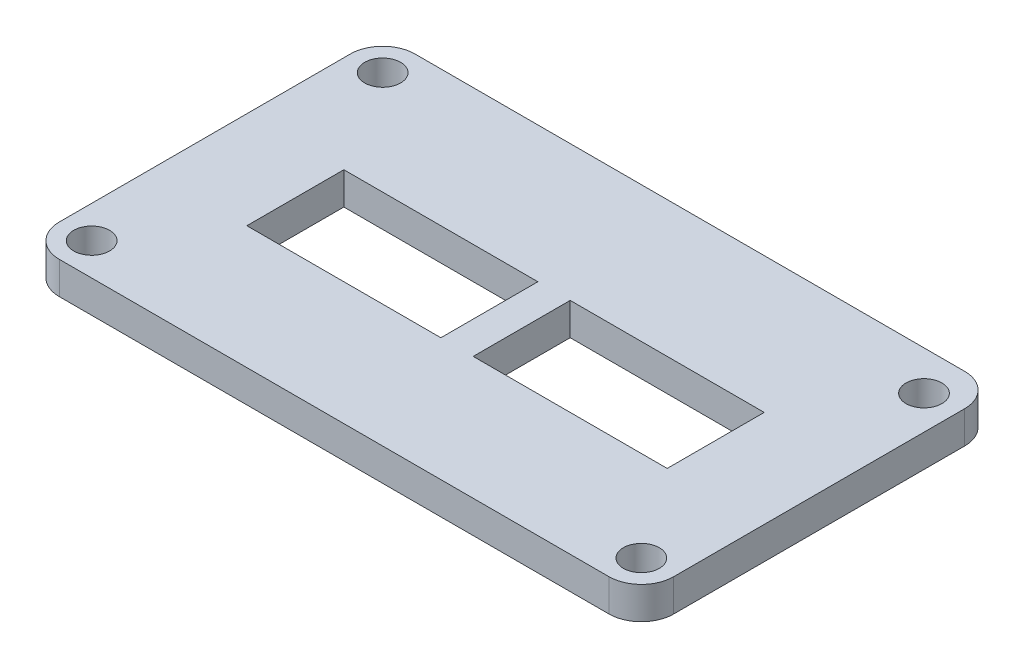
ISO-10303-21;
HEADER;
FILE_DESCRIPTION(('STEP AP214'),'2;1');
FILE_NAME('part.step','',(''),(''),'','','');
FILE_SCHEMA(('AUTOMOTIVE_DESIGN { 1 0 10303 214 1 1 1 1 }'));
ENDSEC;
DATA;
#1=APPLICATION_CONTEXT('core data for automotive mechanical design processes');
#2=APPLICATION_PROTOCOL_DEFINITION('international standard','automotive_design',2000,#1);
#3=PRODUCT_CONTEXT('',#1,'mechanical');
#4=PRODUCT('Part','Part','',(#3));
#5=PRODUCT_RELATED_PRODUCT_CATEGORY('part','',(#4));
#6=PRODUCT_DEFINITION_FORMATION('','',#4);
#7=PRODUCT_DEFINITION_CONTEXT('part definition',#1,'design');
#8=PRODUCT_DEFINITION('design','',#6,#7);
#9=PRODUCT_DEFINITION_SHAPE('','',#8);
#10=(LENGTH_UNIT() NAMED_UNIT(*) SI_UNIT(.MILLI.,.METRE.));
#11=(NAMED_UNIT(*) PLANE_ANGLE_UNIT() SI_UNIT($,.RADIAN.));
#12=(NAMED_UNIT(*) SI_UNIT($,.STERADIAN.) SOLID_ANGLE_UNIT());
#13=UNCERTAINTY_MEASURE_WITH_UNIT(LENGTH_MEASURE(1.E-05),#10,'distance_accuracy_value','');
#14=(GEOMETRIC_REPRESENTATION_CONTEXT(3) GLOBAL_UNCERTAINTY_ASSIGNED_CONTEXT((#13)) GLOBAL_UNIT_ASSIGNED_CONTEXT((#10,
#11,#12)) REPRESENTATION_CONTEXT('',''));
#15=CARTESIAN_POINT('',(0.,0.,0.));
#16=DIRECTION('',(0.,0.,1.));
#17=DIRECTION('',(1.,0.,0.));
#18=AXIS2_PLACEMENT_3D('',#15,#16,#17);
#19=CARTESIAN_POINT('',(-24.13,2.54,13.97));
#20=DIRECTION('',(0.,0.,-1.));
#21=DIRECTION('',(-1.,0.,0.));
#22=AXIS2_PLACEMENT_3D('',#19,#20,#21);
#23=PLANE('',#22);
#24=DIRECTION('',(1.,0.,0.));
#25=VECTOR('',#24,1.);
#26=CARTESIAN_POINT('',(-24.13,0.,13.97));
#27=LINE('',#26,#25);
#28=CARTESIAN_POINT('',(-21.59,0.,13.97));
#29=VERTEX_POINT('',#28);
#30=CARTESIAN_POINT('',(21.59,0.,13.97));
#31=VERTEX_POINT('',#30);
#32=EDGE_CURVE('E179',#29,#31,#27,.T.);
#33=ORIENTED_EDGE('',*,*,#32,.T.);
#34=DIRECTION('',(0.,-1.,0.));
#35=VECTOR('',#34,1.);
#36=CARTESIAN_POINT('',(21.59,2.54,13.97));
#37=LINE('',#36,#35);
#38=CARTESIAN_POINT('',(21.59,2.54,13.97));
#39=VERTEX_POINT('',#38);
#40=EDGE_CURVE('E268',#31,#39,#37,.F.);
#41=ORIENTED_EDGE('',*,*,#40,.T.);
#42=DIRECTION('',(1.,0.,0.));
#43=VECTOR('',#42,1.);
#44=CARTESIAN_POINT('',(-24.13,2.54,13.97));
#45=LINE('',#44,#43);
#46=CARTESIAN_POINT('',(-21.59,2.54,13.97));
#47=VERTEX_POINT('',#46);
#48=EDGE_CURVE('E203',#47,#39,#45,.T.);
#49=ORIENTED_EDGE('',*,*,#48,.F.);
#50=DIRECTION('',(0.,-1.,0.));
#51=VECTOR('',#50,1.);
#52=CARTESIAN_POINT('',(-21.59,2.54,13.97));
#53=LINE('',#52,#51);
#54=EDGE_CURVE('E265',#47,#29,#53,.T.);
#55=ORIENTED_EDGE('',*,*,#54,.T.);
#56=EDGE_LOOP('',(#33,#41,#49,#55));
#57=FACE_BOUND('',#56,.T.);
#58=ADVANCED_FACE('F33',(#57),#23,.F.);
#59=CARTESIAN_POINT('',(24.13,2.54,-13.97));
#60=DIRECTION('',(1.,0.,0.));
#61=DIRECTION('',(0.,0.,-1.));
#62=AXIS2_PLACEMENT_3D('',#59,#60,#61);
#63=PLANE('',#62);
#64=DIRECTION('',(0.,0.,1.));
#65=VECTOR('',#64,1.);
#66=CARTESIAN_POINT('',(24.13,0.,-13.97));
#67=LINE('',#66,#65);
#68=CARTESIAN_POINT('',(24.13,0.,-11.43));
#69=VERTEX_POINT('',#68);
#70=CARTESIAN_POINT('',(24.13,0.,11.43));
#71=VERTEX_POINT('',#70);
#72=EDGE_CURVE('E218',#69,#71,#67,.T.);
#73=ORIENTED_EDGE('',*,*,#72,.F.);
#74=DIRECTION('',(0.,-1.,0.));
#75=VECTOR('',#74,1.);
#76=CARTESIAN_POINT('',(24.13,2.54,-11.43));
#77=LINE('',#76,#75);
#78=CARTESIAN_POINT('',(24.13,2.54,-11.43));
#79=VERTEX_POINT('',#78);
#80=EDGE_CURVE('E256',#69,#79,#77,.F.);
#81=ORIENTED_EDGE('',*,*,#80,.T.);
#82=DIRECTION('',(0.,0.,1.));
#83=VECTOR('',#82,1.);
#84=CARTESIAN_POINT('',(24.13,2.54,-13.97));
#85=LINE('',#84,#83);
#86=CARTESIAN_POINT('',(24.13,2.54,11.43));
#87=VERTEX_POINT('',#86);
#88=EDGE_CURVE('E206',#79,#87,#85,.T.);
#89=ORIENTED_EDGE('',*,*,#88,.T.);
#90=DIRECTION('',(0.,-1.,0.));
#91=VECTOR('',#90,1.);
#92=CARTESIAN_POINT('',(24.13,0.,11.43));
#93=LINE('',#92,#91);
#94=EDGE_CURVE('E253',#87,#71,#93,.T.);
#95=ORIENTED_EDGE('',*,*,#94,.T.);
#96=EDGE_LOOP('',(#73,#81,#89,#95));
#97=FACE_BOUND('',#96,.T.);
#98=ADVANCED_FACE('F292',(#97),#63,.T.);
#99=CARTESIAN_POINT('',(-24.13,2.54,-13.97));
#100=DIRECTION('',(0.,0.,-1.));
#101=DIRECTION('',(-1.,0.,0.));
#102=AXIS2_PLACEMENT_3D('',#99,#100,#101);
#103=PLANE('',#102);
#104=DIRECTION('',(1.,0.,0.));
#105=VECTOR('',#104,1.);
#106=CARTESIAN_POINT('',(-24.13,2.54,-13.97));
#107=LINE('',#106,#105);
#108=CARTESIAN_POINT('',(-21.59,2.54,-13.97));
#109=VERTEX_POINT('',#108);
#110=CARTESIAN_POINT('',(21.59,2.54,-13.97));
#111=VERTEX_POINT('',#110);
#112=EDGE_CURVE('E210',#109,#111,#107,.T.);
#113=ORIENTED_EDGE('',*,*,#112,.T.);
#114=DIRECTION('',(0.,-1.,0.));
#115=VECTOR('',#114,1.);
#116=CARTESIAN_POINT('',(21.59,2.54,-13.97));
#117=LINE('',#116,#115);
#118=CARTESIAN_POINT('',(21.59,0.,-13.97));
#119=VERTEX_POINT('',#118);
#120=EDGE_CURVE('E242',#111,#119,#117,.T.);
#121=ORIENTED_EDGE('',*,*,#120,.T.);
#122=DIRECTION('',(1.,0.,0.));
#123=VECTOR('',#122,1.);
#124=CARTESIAN_POINT('',(-24.13,0.,-13.97));
#125=LINE('',#124,#123);
#126=CARTESIAN_POINT('',(-21.59,0.,-13.97));
#127=VERTEX_POINT('',#126);
#128=EDGE_CURVE('E221',#127,#119,#125,.T.);
#129=ORIENTED_EDGE('',*,*,#128,.F.);
#130=DIRECTION('',(0.,-1.,0.));
#131=VECTOR('',#130,1.);
#132=CARTESIAN_POINT('',(-21.59,2.54,-13.97));
#133=LINE('',#132,#131);
#134=EDGE_CURVE('E240',#127,#109,#133,.F.);
#135=ORIENTED_EDGE('',*,*,#134,.T.);
#136=EDGE_LOOP('',(#113,#121,#129,#135));
#137=FACE_BOUND('',#136,.T.);
#138=ADVANCED_FACE('F299',(#137),#103,.T.);
#139=CARTESIAN_POINT('',(-24.13,2.54,-13.97));
#140=DIRECTION('',(1.,0.,0.));
#141=DIRECTION('',(0.,0.,-1.));
#142=AXIS2_PLACEMENT_3D('',#139,#140,#141);
#143=PLANE('',#142);
#144=DIRECTION('',(0.,0.,1.));
#145=VECTOR('',#144,1.);
#146=CARTESIAN_POINT('',(-24.13,0.,-13.97));
#147=LINE('',#146,#145);
#148=CARTESIAN_POINT('',(-24.13,0.,-11.43));
#149=VERTEX_POINT('',#148);
#150=CARTESIAN_POINT('',(-24.13,0.,11.43));
#151=VERTEX_POINT('',#150);
#152=EDGE_CURVE('E207',#149,#151,#147,.T.);
#153=ORIENTED_EDGE('',*,*,#152,.T.);
#154=DIRECTION('',(0.,-1.,0.));
#155=VECTOR('',#154,1.);
#156=CARTESIAN_POINT('',(-24.13,2.54,11.43));
#157=LINE('',#156,#155);
#158=CARTESIAN_POINT('',(-24.13,2.54,11.43));
#159=VERTEX_POINT('',#158);
#160=EDGE_CURVE('E11',#151,#159,#157,.F.);
#161=ORIENTED_EDGE('',*,*,#160,.T.);
#162=DIRECTION('',(0.,0.,1.));
#163=VECTOR('',#162,1.);
#164=CARTESIAN_POINT('',(-24.13,2.54,-13.97));
#165=LINE('',#164,#163);
#166=CARTESIAN_POINT('',(-24.13,2.54,-11.43));
#167=VERTEX_POINT('',#166);
#168=EDGE_CURVE('E213',#167,#159,#165,.T.);
#169=ORIENTED_EDGE('',*,*,#168,.F.);
#170=DIRECTION('',(0.,-1.,0.));
#171=VECTOR('',#170,1.);
#172=CARTESIAN_POINT('',(-24.13,0.,-11.43));
#173=LINE('',#172,#171);
#174=EDGE_CURVE('E41',#167,#149,#173,.T.);
#175=ORIENTED_EDGE('',*,*,#174,.T.);
#176=EDGE_LOOP('',(#153,#161,#169,#175));
#177=FACE_BOUND('',#176,.T.);
#178=ADVANCED_FACE('F272',(#177),#143,.F.);
#179=CARTESIAN_POINT('',(0.,2.54,0.));
#180=DIRECTION('',(0.,-1.,0.));
#181=DIRECTION('',(0.,0.,-1.));
#182=AXIS2_PLACEMENT_3D('',#179,#180,#181);
#183=PLANE('',#182);
#184=CARTESIAN_POINT('',(21.4835766386377,2.54,-10.8783364759204));
#185=DIRECTION('',(0.,1.,0.));
#186=DIRECTION('',(0.,0.,1.));
#187=AXIS2_PLACEMENT_3D('',#184,#185,#186);
#188=CIRCLE('',#187,1.40969999999999);
#189=CARTESIAN_POINT('',(21.4835766386377,2.54,-9.46863647592038));
#190=VERTEX_POINT('',#189);
#191=EDGE_CURVE('E536',#190,#190,#188,.T.);
#192=ORIENTED_EDGE('',*,*,#191,.F.);
#193=EDGE_LOOP('',(#192));
#194=FACE_BOUND('',#193,.T.);
#195=CARTESIAN_POINT('',(21.59,2.54,11.43));
#196=DIRECTION('',(0.,1.,0.));
#197=DIRECTION('',(0.,0.,1.));
#198=AXIS2_PLACEMENT_3D('',#195,#196,#197);
#199=CIRCLE('',#198,1.40969999999999);
#200=CARTESIAN_POINT('',(21.59,2.54,12.8397));
#201=VERTEX_POINT('',#200);
#202=EDGE_CURVE('E530',#201,#201,#199,.T.);
#203=ORIENTED_EDGE('',*,*,#202,.F.);
#204=EDGE_LOOP('',(#203));
#205=FACE_BOUND('',#204,.T.);
#206=CARTESIAN_POINT('',(-21.59,2.54,11.43));
#207=DIRECTION('',(0.,1.,0.));
#208=DIRECTION('',(0.,0.,1.));
#209=AXIS2_PLACEMENT_3D('',#206,#207,#208);
#210=CIRCLE('',#209,1.40969999999999);
#211=CARTESIAN_POINT('',(-21.59,2.54,12.8397));
#212=VERTEX_POINT('',#211);
#213=EDGE_CURVE('E524',#212,#212,#210,.T.);
#214=ORIENTED_EDGE('',*,*,#213,.F.);
#215=EDGE_LOOP('',(#214));
#216=FACE_BOUND('',#215,.T.);
#217=CARTESIAN_POINT('',(-21.59,2.54,-11.43));
#218=DIRECTION('',(0.,1.,0.));
#219=DIRECTION('',(0.,0.,1.));
#220=AXIS2_PLACEMENT_3D('',#217,#218,#219);
#221=CIRCLE('',#220,1.40969999999999);
#222=CARTESIAN_POINT('',(-21.59,2.54,-10.0203));
#223=VERTEX_POINT('',#222);
#224=EDGE_CURVE('E518',#223,#223,#221,.T.);
#225=ORIENTED_EDGE('',*,*,#224,.F.);
#226=EDGE_LOOP('',(#225));
#227=FACE_BOUND('',#226,.T.);
#228=DIRECTION('',(1.,0.,0.));
#229=VECTOR('',#228,1.);
#230=CARTESIAN_POINT('',(-16.51,2.54,4.318));
#231=LINE('',#230,#229);
#232=CARTESIAN_POINT('',(-16.51,2.54,4.318));
#233=VERTEX_POINT('',#232);
#234=CARTESIAN_POINT('',(-1.27,2.54,4.318));
#235=VERTEX_POINT('',#234);
#236=EDGE_CURVE('E162',#233,#235,#231,.T.);
#237=ORIENTED_EDGE('',*,*,#236,.F.);
#238=DIRECTION('',(0.,0.,1.));
#239=VECTOR('',#238,1.);
#240=CARTESIAN_POINT('',(-16.51,2.54,-3.302));
#241=LINE('',#240,#239);
#242=CARTESIAN_POINT('',(-16.51,2.54,-3.302));
#243=VERTEX_POINT('',#242);
#244=EDGE_CURVE('E167',#243,#233,#241,.T.);
#245=ORIENTED_EDGE('',*,*,#244,.F.);
#246=DIRECTION('',(-1.,0.,0.));
#247=VECTOR('',#246,1.);
#248=CARTESIAN_POINT('',(-16.51,2.54,-3.302));
#249=LINE('',#248,#247);
#250=CARTESIAN_POINT('',(-1.27,2.54,-3.30199999999999));
#251=VERTEX_POINT('',#250);
#252=EDGE_CURVE('E172',#251,#243,#249,.T.);
#253=ORIENTED_EDGE('',*,*,#252,.F.);
#254=DIRECTION('',(0.,0.,-1.));
#255=VECTOR('',#254,1.);
#256=CARTESIAN_POINT('',(-1.27,2.54,-3.30199999999999));
#257=LINE('',#256,#255);
#258=EDGE_CURVE('E151',#235,#251,#257,.T.);
#259=ORIENTED_EDGE('',*,*,#258,.F.);
#260=EDGE_LOOP('',(#237,#245,#253,#259));
#261=FACE_BOUND('',#260,.T.);
#262=DIRECTION('',(1.,0.,0.));
#263=VECTOR('',#262,1.);
#264=CARTESIAN_POINT('',(1.27,2.54,4.318));
#265=LINE('',#264,#263);
#266=CARTESIAN_POINT('',(1.27,2.54,4.318));
#267=VERTEX_POINT('',#266);
#268=CARTESIAN_POINT('',(16.51,2.54,4.318));
#269=VERTEX_POINT('',#268);
#270=EDGE_CURVE('E184',#267,#269,#265,.T.);
#271=ORIENTED_EDGE('',*,*,#270,.F.);
#272=DIRECTION('',(0.,0.,1.));
#273=VECTOR('',#272,1.);
#274=CARTESIAN_POINT('',(1.27,2.54,-3.302));
#275=LINE('',#274,#273);
#276=CARTESIAN_POINT('',(1.27,2.54,-3.302));
#277=VERTEX_POINT('',#276);
#278=EDGE_CURVE('E182',#277,#267,#275,.T.);
#279=ORIENTED_EDGE('',*,*,#278,.F.);
#280=DIRECTION('',(-1.,0.,0.));
#281=VECTOR('',#280,1.);
#282=CARTESIAN_POINT('',(1.27,2.54,-3.302));
#283=LINE('',#282,#281);
#284=CARTESIAN_POINT('',(16.51,2.54,-3.302));
#285=VERTEX_POINT('',#284);
#286=EDGE_CURVE('E191',#285,#277,#283,.T.);
#287=ORIENTED_EDGE('',*,*,#286,.F.);
#288=DIRECTION('',(0.,0.,-1.));
#289=VECTOR('',#288,1.);
#290=CARTESIAN_POINT('',(16.51,2.54,-3.302));
#291=LINE('',#290,#289);
#292=EDGE_CURVE('E188',#269,#285,#291,.T.);
#293=ORIENTED_EDGE('',*,*,#292,.F.);
#294=EDGE_LOOP('',(#271,#279,#287,#293));
#295=FACE_BOUND('',#294,.T.);
#296=ORIENTED_EDGE('',*,*,#88,.F.);
#297=CARTESIAN_POINT('',(21.59,2.54,-11.43));
#298=DIRECTION('',(0.,-1.,0.));
#299=DIRECTION('',(0.,0.,-1.));
#300=AXIS2_PLACEMENT_3D('',#297,#298,#299);
#301=CIRCLE('',#300,2.54);
#302=EDGE_CURVE('E263',#79,#111,#301,.F.);
#303=ORIENTED_EDGE('',*,*,#302,.T.);
#304=ORIENTED_EDGE('',*,*,#112,.F.);
#305=CARTESIAN_POINT('',(-21.59,2.54,-11.43));
#306=DIRECTION('',(0.,-1.,0.));
#307=DIRECTION('',(0.,0.,-1.));
#308=AXIS2_PLACEMENT_3D('',#305,#306,#307);
#309=CIRCLE('',#308,2.54);
#310=EDGE_CURVE('E53',#109,#167,#309,.F.);
#311=ORIENTED_EDGE('',*,*,#310,.T.);
#312=ORIENTED_EDGE('',*,*,#168,.T.);
#313=CARTESIAN_POINT('',(-21.59,2.54,11.43));
#314=DIRECTION('',(0.,-1.,0.));
#315=DIRECTION('',(0.,0.,-1.));
#316=AXIS2_PLACEMENT_3D('',#313,#314,#315);
#317=CIRCLE('',#316,2.54);
#318=EDGE_CURVE('E259',#159,#47,#317,.F.);
#319=ORIENTED_EDGE('',*,*,#318,.T.);
#320=ORIENTED_EDGE('',*,*,#48,.T.);
#321=CARTESIAN_POINT('',(21.59,2.54,11.43));
#322=DIRECTION('',(0.,-1.,0.));
#323=DIRECTION('',(0.,0.,-1.));
#324=AXIS2_PLACEMENT_3D('',#321,#322,#323);
#325=CIRCLE('',#324,2.54);
#326=EDGE_CURVE('E261',#39,#87,#325,.F.);
#327=ORIENTED_EDGE('',*,*,#326,.T.);
#328=EDGE_LOOP('',(#296,#303,#304,#311,#312,#319,#320,#327));
#329=FACE_BOUND('',#328,.T.);
#330=ADVANCED_FACE('F169',(#194,#205,#216,#227,#261,#295,#329),#183,.F.);
#331=CARTESIAN_POINT('',(0.,0.,0.));
#332=DIRECTION('',(0.,-1.,0.));
#333=DIRECTION('',(0.,0.,-1.));
#334=AXIS2_PLACEMENT_3D('',#331,#332,#333);
#335=PLANE('',#334);
#336=CARTESIAN_POINT('',(21.4835766386377,0.,-10.8783364759204));
#337=DIRECTION('',(0.,1.,0.));
#338=DIRECTION('',(0.,0.,1.));
#339=AXIS2_PLACEMENT_3D('',#336,#337,#338);
#340=CIRCLE('',#339,1.4097);
#341=CARTESIAN_POINT('',(21.4835766386377,0.,-9.46863647592036));
#342=VERTEX_POINT('',#341);
#343=EDGE_CURVE('E533',#342,#342,#340,.T.);
#344=ORIENTED_EDGE('',*,*,#343,.T.);
#345=EDGE_LOOP('',(#344));
#346=FACE_BOUND('',#345,.T.);
#347=CARTESIAN_POINT('',(21.59,0.,11.43));
#348=DIRECTION('',(0.,1.,0.));
#349=DIRECTION('',(0.,0.,1.));
#350=AXIS2_PLACEMENT_3D('',#347,#348,#349);
#351=CIRCLE('',#350,1.4097);
#352=CARTESIAN_POINT('',(21.59,0.,12.8397));
#353=VERTEX_POINT('',#352);
#354=EDGE_CURVE('E527',#353,#353,#351,.T.);
#355=ORIENTED_EDGE('',*,*,#354,.T.);
#356=EDGE_LOOP('',(#355));
#357=FACE_BOUND('',#356,.T.);
#358=CARTESIAN_POINT('',(-21.59,0.,11.43));
#359=DIRECTION('',(0.,1.,0.));
#360=DIRECTION('',(0.,0.,1.));
#361=AXIS2_PLACEMENT_3D('',#358,#359,#360);
#362=CIRCLE('',#361,1.4097);
#363=CARTESIAN_POINT('',(-21.59,0.,12.8397));
#364=VERTEX_POINT('',#363);
#365=EDGE_CURVE('E521',#364,#364,#362,.T.);
#366=ORIENTED_EDGE('',*,*,#365,.T.);
#367=EDGE_LOOP('',(#366));
#368=FACE_BOUND('',#367,.T.);
#369=CARTESIAN_POINT('',(-21.59,0.,-11.43));
#370=DIRECTION('',(0.,1.,0.));
#371=DIRECTION('',(0.,0.,1.));
#372=AXIS2_PLACEMENT_3D('',#369,#370,#371);
#373=CIRCLE('',#372,1.4097);
#374=CARTESIAN_POINT('',(-21.59,0.,-10.0203));
#375=VERTEX_POINT('',#374);
#376=EDGE_CURVE('E185',#375,#375,#373,.T.);
#377=ORIENTED_EDGE('',*,*,#376,.T.);
#378=EDGE_LOOP('',(#377));
#379=FACE_BOUND('',#378,.T.);
#380=DIRECTION('',(0.,0.,-1.));
#381=VECTOR('',#380,1.);
#382=CARTESIAN_POINT('',(-16.51,0.,0.));
#383=LINE('',#382,#381);
#384=CARTESIAN_POINT('',(-16.51,0.,4.318));
#385=VERTEX_POINT('',#384);
#386=CARTESIAN_POINT('',(-16.51,0.,-3.302));
#387=VERTEX_POINT('',#386);
#388=EDGE_CURVE('E238',#385,#387,#383,.T.);
#389=ORIENTED_EDGE('',*,*,#388,.F.);
#390=DIRECTION('',(-1.,0.,0.));
#391=VECTOR('',#390,1.);
#392=CARTESIAN_POINT('',(0.,0.,4.318));
#393=LINE('',#392,#391);
#394=CARTESIAN_POINT('',(-1.27,0.,4.318));
#395=VERTEX_POINT('',#394);
#396=EDGE_CURVE('E233',#395,#385,#393,.T.);
#397=ORIENTED_EDGE('',*,*,#396,.F.);
#398=DIRECTION('',(0.,0.,1.));
#399=VECTOR('',#398,1.);
#400=CARTESIAN_POINT('',(-1.27,0.,0.));
#401=LINE('',#400,#399);
#402=CARTESIAN_POINT('',(-1.27,0.,-3.30199999999999));
#403=VERTEX_POINT('',#402);
#404=EDGE_CURVE('E154',#403,#395,#401,.T.);
#405=ORIENTED_EDGE('',*,*,#404,.F.);
#406=DIRECTION('',(1.,0.,0.));
#407=VECTOR('',#406,1.);
#408=CARTESIAN_POINT('',(0.,0.,-3.30199999999999));
#409=LINE('',#408,#407);
#410=EDGE_CURVE('E236',#387,#403,#409,.T.);
#411=ORIENTED_EDGE('',*,*,#410,.F.);
#412=EDGE_LOOP('',(#389,#397,#405,#411));
#413=FACE_BOUND('',#412,.T.);
#414=DIRECTION('',(0.,0.,-1.));
#415=VECTOR('',#414,1.);
#416=CARTESIAN_POINT('',(1.27,0.,0.));
#417=LINE('',#416,#415);
#418=CARTESIAN_POINT('',(1.27,0.,4.318));
#419=VERTEX_POINT('',#418);
#420=CARTESIAN_POINT('',(1.27,0.,-3.302));
#421=VERTEX_POINT('',#420);
#422=EDGE_CURVE('E231',#419,#421,#417,.T.);
#423=ORIENTED_EDGE('',*,*,#422,.F.);
#424=DIRECTION('',(-1.,0.,0.));
#425=VECTOR('',#424,1.);
#426=CARTESIAN_POINT('',(0.,0.,4.318));
#427=LINE('',#426,#425);
#428=CARTESIAN_POINT('',(16.51,0.,4.318));
#429=VERTEX_POINT('',#428);
#430=EDGE_CURVE('E215',#429,#419,#427,.T.);
#431=ORIENTED_EDGE('',*,*,#430,.F.);
#432=DIRECTION('',(0.,0.,1.));
#433=VECTOR('',#432,1.);
#434=CARTESIAN_POINT('',(16.51,0.,0.));
#435=LINE('',#434,#433);
#436=CARTESIAN_POINT('',(16.51,0.,-3.302));
#437=VERTEX_POINT('',#436);
#438=EDGE_CURVE('E226',#437,#429,#435,.T.);
#439=ORIENTED_EDGE('',*,*,#438,.F.);
#440=DIRECTION('',(1.,0.,0.));
#441=VECTOR('',#440,1.);
#442=CARTESIAN_POINT('',(0.,0.,-3.302));
#443=LINE('',#442,#441);
#444=EDGE_CURVE('E229',#421,#437,#443,.T.);
#445=ORIENTED_EDGE('',*,*,#444,.F.);
#446=EDGE_LOOP('',(#423,#431,#439,#445));
#447=FACE_BOUND('',#446,.T.);
#448=ORIENTED_EDGE('',*,*,#128,.T.);
#449=CARTESIAN_POINT('',(21.59,0.,-11.43));
#450=DIRECTION('',(0.,-1.,0.));
#451=DIRECTION('',(0.,0.,-1.));
#452=AXIS2_PLACEMENT_3D('',#449,#450,#451);
#453=CIRCLE('',#452,2.54);
#454=EDGE_CURVE('E251',#119,#69,#453,.T.);
#455=ORIENTED_EDGE('',*,*,#454,.T.);
#456=ORIENTED_EDGE('',*,*,#72,.T.);
#457=CARTESIAN_POINT('',(21.59,0.,11.43));
#458=DIRECTION('',(0.,-1.,0.));
#459=DIRECTION('',(0.,0.,-1.));
#460=AXIS2_PLACEMENT_3D('',#457,#458,#459);
#461=CIRCLE('',#460,2.54);
#462=EDGE_CURVE('E249',#71,#31,#461,.T.);
#463=ORIENTED_EDGE('',*,*,#462,.T.);
#464=ORIENTED_EDGE('',*,*,#32,.F.);
#465=CARTESIAN_POINT('',(-21.59,0.,11.43));
#466=DIRECTION('',(0.,-1.,0.));
#467=DIRECTION('',(0.,0.,-1.));
#468=AXIS2_PLACEMENT_3D('',#465,#466,#467);
#469=CIRCLE('',#468,2.54);
#470=EDGE_CURVE('E247',#29,#151,#469,.T.);
#471=ORIENTED_EDGE('',*,*,#470,.T.);
#472=ORIENTED_EDGE('',*,*,#152,.F.);
#473=CARTESIAN_POINT('',(-21.59,0.,-11.43));
#474=DIRECTION('',(0.,-1.,0.));
#475=DIRECTION('',(0.,0.,-1.));
#476=AXIS2_PLACEMENT_3D('',#473,#474,#475);
#477=CIRCLE('',#476,2.54);
#478=EDGE_CURVE('E245',#149,#127,#477,.T.);
#479=ORIENTED_EDGE('',*,*,#478,.T.);
#480=EDGE_LOOP('',(#448,#455,#456,#463,#464,#471,#472,#479));
#481=FACE_BOUND('',#480,.T.);
#482=ADVANCED_FACE('F275',(#346,#357,#368,#379,#413,#447,#481),#335,.T.);
#483=CARTESIAN_POINT('',(1.27,-12.954,-3.302));
#484=DIRECTION('',(-1.,0.,0.));
#485=DIRECTION('',(0.,0.,1.));
#486=AXIS2_PLACEMENT_3D('',#483,#484,#485);
#487=PLANE('',#486);
#488=ORIENTED_EDGE('',*,*,#422,.T.);
#489=DIRECTION('',(0.,1.,0.));
#490=VECTOR('',#489,1.);
#491=CARTESIAN_POINT('',(1.27,-12.954,-3.302));
#492=LINE('',#491,#490);
#493=EDGE_CURVE('E195',#421,#277,#492,.T.);
#494=ORIENTED_EDGE('',*,*,#493,.T.);
#495=ORIENTED_EDGE('',*,*,#278,.T.);
#496=DIRECTION('',(0.,1.,0.));
#497=VECTOR('',#496,1.);
#498=CARTESIAN_POINT('',(1.27,-12.954,4.318));
#499=LINE('',#498,#497);
#500=EDGE_CURVE('E194',#419,#267,#499,.T.);
#501=ORIENTED_EDGE('',*,*,#500,.F.);
#502=EDGE_LOOP('',(#488,#494,#495,#501));
#503=FACE_BOUND('',#502,.T.);
#504=ADVANCED_FACE('F355',(#503),#487,.F.);
#505=CARTESIAN_POINT('',(1.27,-12.954,-3.302));
#506=DIRECTION('',(0.,0.,-1.));
#507=DIRECTION('',(-1.,0.,0.));
#508=AXIS2_PLACEMENT_3D('',#505,#506,#507);
#509=PLANE('',#508);
#510=ORIENTED_EDGE('',*,*,#444,.T.);
#511=DIRECTION('',(0.,1.,0.));
#512=VECTOR('',#511,1.);
#513=CARTESIAN_POINT('',(16.51,-12.954,-3.302));
#514=LINE('',#513,#512);
#515=EDGE_CURVE('E197',#437,#285,#514,.T.);
#516=ORIENTED_EDGE('',*,*,#515,.T.);
#517=ORIENTED_EDGE('',*,*,#286,.T.);
#518=ORIENTED_EDGE('',*,*,#493,.F.);
#519=EDGE_LOOP('',(#510,#516,#517,#518));
#520=FACE_BOUND('',#519,.T.);
#521=ADVANCED_FACE('F411',(#520),#509,.F.);
#522=CARTESIAN_POINT('',(16.51,-12.954,-3.302));
#523=DIRECTION('',(1.,0.,0.));
#524=DIRECTION('',(0.,0.,-1.));
#525=AXIS2_PLACEMENT_3D('',#522,#523,#524);
#526=PLANE('',#525);
#527=ORIENTED_EDGE('',*,*,#438,.T.);
#528=DIRECTION('',(0.,1.,0.));
#529=VECTOR('',#528,1.);
#530=CARTESIAN_POINT('',(16.51,-12.954,4.318));
#531=LINE('',#530,#529);
#532=EDGE_CURVE('E199',#429,#269,#531,.T.);
#533=ORIENTED_EDGE('',*,*,#532,.T.);
#534=ORIENTED_EDGE('',*,*,#292,.T.);
#535=ORIENTED_EDGE('',*,*,#515,.F.);
#536=EDGE_LOOP('',(#527,#533,#534,#535));
#537=FACE_BOUND('',#536,.T.);
#538=ADVANCED_FACE('F414',(#537),#526,.F.);
#539=CARTESIAN_POINT('',(1.27,-12.954,4.318));
#540=DIRECTION('',(0.,0.,1.));
#541=DIRECTION('',(1.,0.,0.));
#542=AXIS2_PLACEMENT_3D('',#539,#540,#541);
#543=PLANE('',#542);
#544=ORIENTED_EDGE('',*,*,#430,.T.);
#545=ORIENTED_EDGE('',*,*,#500,.T.);
#546=ORIENTED_EDGE('',*,*,#270,.T.);
#547=ORIENTED_EDGE('',*,*,#532,.F.);
#548=EDGE_LOOP('',(#544,#545,#546,#547));
#549=FACE_BOUND('',#548,.T.);
#550=ADVANCED_FACE('F409',(#549),#543,.F.);
#551=CARTESIAN_POINT('',(-16.51,-12.954,-3.302));
#552=DIRECTION('',(-1.,0.,0.));
#553=DIRECTION('',(0.,0.,1.));
#554=AXIS2_PLACEMENT_3D('',#551,#552,#553);
#555=PLANE('',#554);
#556=ORIENTED_EDGE('',*,*,#388,.T.);
#557=DIRECTION('',(0.,1.,0.));
#558=VECTOR('',#557,1.);
#559=CARTESIAN_POINT('',(-16.51,-12.954,-3.302));
#560=LINE('',#559,#558);
#561=EDGE_CURVE('E177',#387,#243,#560,.T.);
#562=ORIENTED_EDGE('',*,*,#561,.T.);
#563=ORIENTED_EDGE('',*,*,#244,.T.);
#564=DIRECTION('',(0.,1.,0.));
#565=VECTOR('',#564,1.);
#566=CARTESIAN_POINT('',(-16.51,-12.954,4.318));
#567=LINE('',#566,#565);
#568=EDGE_CURVE('E158',#385,#233,#567,.T.);
#569=ORIENTED_EDGE('',*,*,#568,.F.);
#570=EDGE_LOOP('',(#556,#562,#563,#569));
#571=FACE_BOUND('',#570,.T.);
#572=ADVANCED_FACE('F402',(#571),#555,.F.);
#573=CARTESIAN_POINT('',(-16.51,-12.954,-3.302));
#574=DIRECTION('',(0.,0.,-1.));
#575=DIRECTION('',(-1.,0.,0.));
#576=AXIS2_PLACEMENT_3D('',#573,#574,#575);
#577=PLANE('',#576);
#578=ORIENTED_EDGE('',*,*,#410,.T.);
#579=DIRECTION('',(0.,1.,0.));
#580=VECTOR('',#579,1.);
#581=CARTESIAN_POINT('',(-1.27,-12.954,-3.30199999999999));
#582=LINE('',#581,#580);
#583=EDGE_CURVE('E157',#403,#251,#582,.T.);
#584=ORIENTED_EDGE('',*,*,#583,.T.);
#585=ORIENTED_EDGE('',*,*,#252,.T.);
#586=ORIENTED_EDGE('',*,*,#561,.F.);
#587=EDGE_LOOP('',(#578,#584,#585,#586));
#588=FACE_BOUND('',#587,.T.);
#589=ADVANCED_FACE('F399',(#588),#577,.F.);
#590=CARTESIAN_POINT('',(-1.27,-12.954,-3.30199999999999));
#591=DIRECTION('',(1.,0.,0.));
#592=DIRECTION('',(0.,0.,-1.));
#593=AXIS2_PLACEMENT_3D('',#590,#591,#592);
#594=PLANE('',#593);
#595=ORIENTED_EDGE('',*,*,#404,.T.);
#596=DIRECTION('',(0.,1.,0.));
#597=VECTOR('',#596,1.);
#598=CARTESIAN_POINT('',(-1.27,-12.954,4.318));
#599=LINE('',#598,#597);
#600=EDGE_CURVE('E146',#395,#235,#599,.T.);
#601=ORIENTED_EDGE('',*,*,#600,.T.);
#602=ORIENTED_EDGE('',*,*,#258,.T.);
#603=ORIENTED_EDGE('',*,*,#583,.F.);
#604=EDGE_LOOP('',(#595,#601,#602,#603));
#605=FACE_BOUND('',#604,.T.);
#606=ADVANCED_FACE('F148',(#605),#594,.F.);
#607=CARTESIAN_POINT('',(-16.51,-12.954,4.318));
#608=DIRECTION('',(0.,0.,1.));
#609=DIRECTION('',(1.,0.,0.));
#610=AXIS2_PLACEMENT_3D('',#607,#608,#609);
#611=PLANE('',#610);
#612=ORIENTED_EDGE('',*,*,#396,.T.);
#613=ORIENTED_EDGE('',*,*,#568,.T.);
#614=ORIENTED_EDGE('',*,*,#236,.T.);
#615=ORIENTED_EDGE('',*,*,#600,.F.);
#616=EDGE_LOOP('',(#612,#613,#614,#615));
#617=FACE_BOUND('',#616,.T.);
#618=ADVANCED_FACE('F163',(#617),#611,.F.);
#619=CARTESIAN_POINT('',(21.59,2.54,-11.43));
#620=DIRECTION('',(0.,-1.,0.));
#621=DIRECTION('',(0.,0.,-1.));
#622=AXIS2_PLACEMENT_3D('',#619,#620,#621);
#623=CYLINDRICAL_SURFACE('',#622,2.54);
#624=ORIENTED_EDGE('',*,*,#302,.F.);
#625=ORIENTED_EDGE('',*,*,#80,.F.);
#626=ORIENTED_EDGE('',*,*,#454,.F.);
#627=ORIENTED_EDGE('',*,*,#120,.F.);
#628=EDGE_LOOP('',(#624,#625,#626,#627));
#629=FACE_BOUND('',#628,.T.);
#630=ADVANCED_FACE('F297',(#629),#623,.T.);
#631=CARTESIAN_POINT('',(21.59,2.54,11.43));
#632=DIRECTION('',(0.,1.,0.));
#633=DIRECTION('',(0.,0.,1.));
#634=AXIS2_PLACEMENT_3D('',#631,#632,#633);
#635=CYLINDRICAL_SURFACE('',#634,2.54);
#636=ORIENTED_EDGE('',*,*,#326,.F.);
#637=ORIENTED_EDGE('',*,*,#40,.F.);
#638=ORIENTED_EDGE('',*,*,#462,.F.);
#639=ORIENTED_EDGE('',*,*,#94,.F.);
#640=EDGE_LOOP('',(#636,#637,#638,#639));
#641=FACE_BOUND('',#640,.T.);
#642=ADVANCED_FACE('F289',(#641),#635,.T.);
#643=CARTESIAN_POINT('',(-21.59,2.54,11.43));
#644=DIRECTION('',(0.,-1.,0.));
#645=DIRECTION('',(0.,0.,-1.));
#646=AXIS2_PLACEMENT_3D('',#643,#644,#645);
#647=CYLINDRICAL_SURFACE('',#646,2.54);
#648=ORIENTED_EDGE('',*,*,#318,.F.);
#649=ORIENTED_EDGE('',*,*,#160,.F.);
#650=ORIENTED_EDGE('',*,*,#470,.F.);
#651=ORIENTED_EDGE('',*,*,#54,.F.);
#652=EDGE_LOOP('',(#648,#649,#650,#651));
#653=FACE_BOUND('',#652,.T.);
#654=ADVANCED_FACE('F281',(#653),#647,.T.);
#655=CARTESIAN_POINT('',(-21.59,2.54,-11.43));
#656=DIRECTION('',(0.,1.,0.));
#657=DIRECTION('',(0.,0.,1.));
#658=AXIS2_PLACEMENT_3D('',#655,#656,#657);
#659=CYLINDRICAL_SURFACE('',#658,2.54);
#660=ORIENTED_EDGE('',*,*,#310,.F.);
#661=ORIENTED_EDGE('',*,*,#134,.F.);
#662=ORIENTED_EDGE('',*,*,#478,.F.);
#663=ORIENTED_EDGE('',*,*,#174,.F.);
#664=EDGE_LOOP('',(#660,#661,#662,#663));
#665=FACE_BOUND('',#664,.T.);
#666=ADVANCED_FACE('F35',(#665),#659,.T.);
#667=CARTESIAN_POINT('',(-21.59,2.54,-11.43));
#668=DIRECTION('',(0.,1.,0.));
#669=DIRECTION('',(0.,0.,1.));
#670=AXIS2_PLACEMENT_3D('',#667,#668,#669);
#671=CYLINDRICAL_SURFACE('',#670,1.40969999999999);
#672=ORIENTED_EDGE('',*,*,#376,.F.);
#673=EDGE_LOOP('',(#672));
#674=FACE_BOUND('',#673,.T.);
#675=ORIENTED_EDGE('',*,*,#224,.T.);
#676=EDGE_LOOP('',(#675));
#677=FACE_BOUND('',#676,.T.);
#678=ADVANCED_FACE('F302',(#674,#677),#671,.F.);
#679=CARTESIAN_POINT('',(-21.59,2.54,11.43));
#680=DIRECTION('',(0.,1.,0.));
#681=DIRECTION('',(0.,0.,1.));
#682=AXIS2_PLACEMENT_3D('',#679,#680,#681);
#683=CYLINDRICAL_SURFACE('',#682,1.40969999999999);
#684=ORIENTED_EDGE('',*,*,#365,.F.);
#685=EDGE_LOOP('',(#684));
#686=FACE_BOUND('',#685,.T.);
#687=ORIENTED_EDGE('',*,*,#213,.T.);
#688=EDGE_LOOP('',(#687));
#689=FACE_BOUND('',#688,.T.);
#690=ADVANCED_FACE('F307',(#686,#689),#683,.F.);
#691=CARTESIAN_POINT('',(21.59,2.54,11.43));
#692=DIRECTION('',(0.,1.,0.));
#693=DIRECTION('',(0.,0.,1.));
#694=AXIS2_PLACEMENT_3D('',#691,#692,#693);
#695=CYLINDRICAL_SURFACE('',#694,1.40969999999999);
#696=ORIENTED_EDGE('',*,*,#354,.F.);
#697=EDGE_LOOP('',(#696));
#698=FACE_BOUND('',#697,.T.);
#699=ORIENTED_EDGE('',*,*,#202,.T.);
#700=EDGE_LOOP('',(#699));
#701=FACE_BOUND('',#700,.T.);
#702=ADVANCED_FACE('F372',(#698,#701),#695,.F.);
#703=CARTESIAN_POINT('',(21.4835766386377,2.54,-10.8783364759204));
#704=DIRECTION('',(0.,1.,0.));
#705=DIRECTION('',(0.,0.,1.));
#706=AXIS2_PLACEMENT_3D('',#703,#704,#705);
#707=CYLINDRICAL_SURFACE('',#706,1.40969999999999);
#708=ORIENTED_EDGE('',*,*,#343,.F.);
#709=EDGE_LOOP('',(#708));
#710=FACE_BOUND('',#709,.T.);
#711=ORIENTED_EDGE('',*,*,#191,.T.);
#712=EDGE_LOOP('',(#711));
#713=FACE_BOUND('',#712,.T.);
#714=ADVANCED_FACE('F382',(#710,#713),#707,.F.);
#715=CLOSED_SHELL('',(#58,#98,#138,#178,#330,#482,#504,#521,#538,#550,#572,#589,#606,#618,#630,
#642,#654,#666,#678,#690,#702,#714));
#716=MANIFOLD_SOLID_BREP('B2',#715);
#717=ADVANCED_BREP_SHAPE_REPRESENTATION('',(#18,#716),#14);
#718=SHAPE_DEFINITION_REPRESENTATION(#9,#717);
ENDSEC;
END-ISO-10303-21;
